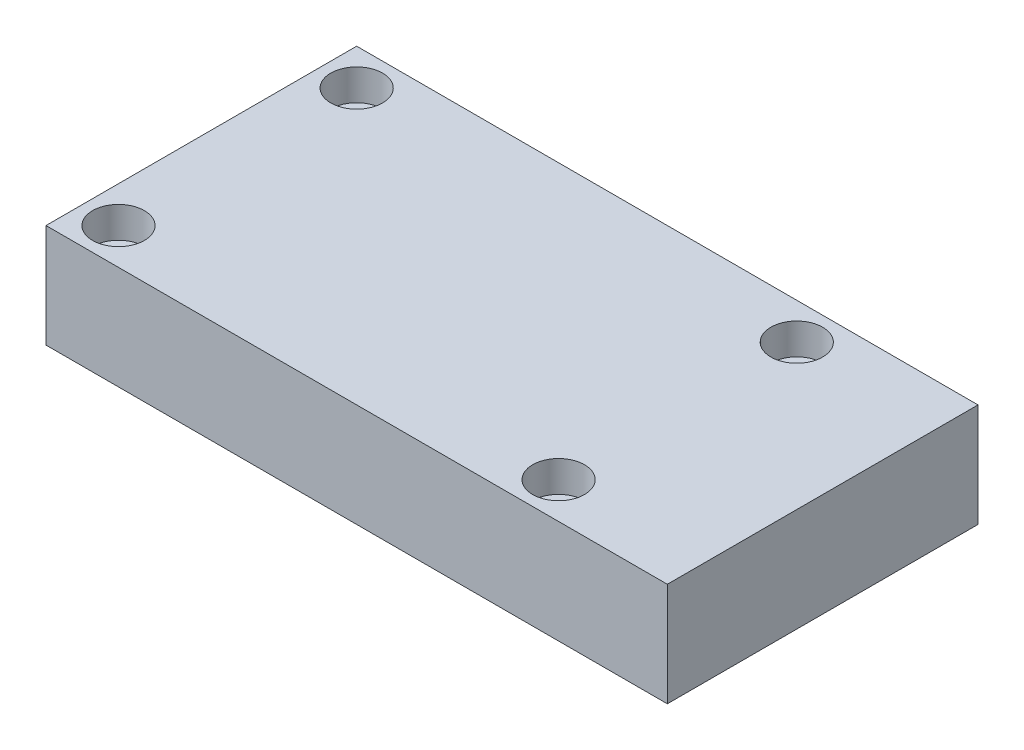
ISO-10303-21;
HEADER;
FILE_DESCRIPTION(('STEP AP214'),'2;1');
FILE_NAME('part.step','',(''),(''),'','','');
FILE_SCHEMA(('AUTOMOTIVE_DESIGN { 1 0 10303 214 1 1 1 1 }'));
ENDSEC;
DATA;
#1=APPLICATION_CONTEXT('core data for automotive mechanical design processes');
#2=APPLICATION_PROTOCOL_DEFINITION('international standard','automotive_design',2000,#1);
#3=PRODUCT_CONTEXT('',#1,'mechanical');
#4=PRODUCT('Part','Part','',(#3));
#5=PRODUCT_RELATED_PRODUCT_CATEGORY('part','',(#4));
#6=PRODUCT_DEFINITION_FORMATION('','',#4);
#7=PRODUCT_DEFINITION_CONTEXT('part definition',#1,'design');
#8=PRODUCT_DEFINITION('design','',#6,#7);
#9=PRODUCT_DEFINITION_SHAPE('','',#8);
#10=(LENGTH_UNIT() NAMED_UNIT(*) SI_UNIT(.MILLI.,.METRE.));
#11=(NAMED_UNIT(*) PLANE_ANGLE_UNIT() SI_UNIT($,.RADIAN.));
#12=(NAMED_UNIT(*) SI_UNIT($,.STERADIAN.) SOLID_ANGLE_UNIT());
#13=UNCERTAINTY_MEASURE_WITH_UNIT(LENGTH_MEASURE(1.E-05),#10,'distance_accuracy_value','');
#14=(GEOMETRIC_REPRESENTATION_CONTEXT(3) GLOBAL_UNCERTAINTY_ASSIGNED_CONTEXT((#13)) GLOBAL_UNIT_ASSIGNED_CONTEXT((#10,
#11,#12)) REPRESENTATION_CONTEXT('',''));
#15=CARTESIAN_POINT('',(0.,0.,0.));
#16=DIRECTION('',(0.,0.,1.));
#17=DIRECTION('',(1.,0.,0.));
#18=AXIS2_PLACEMENT_3D('',#15,#16,#17);
#19=CARTESIAN_POINT('',(-55.7302262684999,25.4,42.36681927311));
#20=DIRECTION('',(1.,0.,0.));
#21=DIRECTION('',(0.,0.,-1.));
#22=AXIS2_PLACEMENT_3D('',#19,#20,#21);
#23=PLANE('',#22);
#24=DIRECTION('',(0.,0.,1.));
#25=VECTOR('',#24,1.);
#26=CARTESIAN_POINT('',(-55.7302262684999,0.,42.36681927311));
#27=LINE('',#26,#25);
#28=CARTESIAN_POINT('',(-55.7302262684999,0.,-33.8331807268901));
#29=VERTEX_POINT('',#28);
#30=CARTESIAN_POINT('',(-55.7302262684999,0.,42.36681927311));
#31=VERTEX_POINT('',#30);
#32=EDGE_CURVE('E96',#29,#31,#27,.T.);
#33=ORIENTED_EDGE('',*,*,#32,.T.);
#34=DIRECTION('',(0.,-1.,0.));
#35=VECTOR('',#34,1.);
#36=CARTESIAN_POINT('',(-55.7302262684999,25.4,42.36681927311));
#37=LINE('',#36,#35);
#38=CARTESIAN_POINT('',(-55.7302262684999,25.4,42.36681927311));
#39=VERTEX_POINT('',#38);
#40=EDGE_CURVE('E11',#39,#31,#37,.T.);
#41=ORIENTED_EDGE('',*,*,#40,.F.);
#42=DIRECTION('',(0.,0.,1.));
#43=VECTOR('',#42,1.);
#44=CARTESIAN_POINT('',(-55.7302262684999,25.4,42.36681927311));
#45=LINE('',#44,#43);
#46=CARTESIAN_POINT('',(-55.7302262684999,25.4,-33.8331807268901));
#47=VERTEX_POINT('',#46);
#48=EDGE_CURVE('E84',#47,#39,#45,.T.);
#49=ORIENTED_EDGE('',*,*,#48,.F.);
#50=DIRECTION('',(0.,-1.,0.));
#51=VECTOR('',#50,1.);
#52=CARTESIAN_POINT('',(-55.7302262684999,25.4,-33.8331807268901));
#53=LINE('',#52,#51);
#54=EDGE_CURVE('E92',#47,#29,#53,.T.);
#55=ORIENTED_EDGE('',*,*,#54,.T.);
#56=EDGE_LOOP('',(#33,#41,#49,#55));
#57=FACE_BOUND('',#56,.T.);
#58=ADVANCED_FACE('F33',(#57),#23,.F.);
#59=CARTESIAN_POINT('',(-55.7302262684999,25.4,42.36681927311));
#60=DIRECTION('',(0.,0.,-1.));
#61=DIRECTION('',(-1.,0.,0.));
#62=AXIS2_PLACEMENT_3D('',#59,#60,#61);
#63=PLANE('',#62);
#64=DIRECTION('',(1.,0.,0.));
#65=VECTOR('',#64,1.);
#66=CARTESIAN_POINT('',(-55.7302262684999,0.,42.36681927311));
#67=LINE('',#66,#65);
#68=CARTESIAN_POINT('',(96.6697737315001,0.,42.36681927311));
#69=VERTEX_POINT('',#68);
#70=EDGE_CURVE('E88',#31,#69,#67,.T.);
#71=ORIENTED_EDGE('',*,*,#70,.T.);
#72=DIRECTION('',(0.,-1.,0.));
#73=VECTOR('',#72,1.);
#74=CARTESIAN_POINT('',(96.6697737315001,25.4,42.36681927311));
#75=LINE('',#74,#73);
#76=CARTESIAN_POINT('',(96.6697737315001,25.4,42.36681927311));
#77=VERTEX_POINT('',#76);
#78=EDGE_CURVE('E41',#77,#69,#75,.T.);
#79=ORIENTED_EDGE('',*,*,#78,.F.);
#80=DIRECTION('',(1.,0.,0.));
#81=VECTOR('',#80,1.);
#82=CARTESIAN_POINT('',(-55.7302262684999,25.4,42.36681927311));
#83=LINE('',#82,#81);
#84=EDGE_CURVE('E79',#39,#77,#83,.T.);
#85=ORIENTED_EDGE('',*,*,#84,.F.);
#86=ORIENTED_EDGE('',*,*,#40,.T.);
#87=EDGE_LOOP('',(#71,#79,#85,#86));
#88=FACE_BOUND('',#87,.T.);
#89=ADVANCED_FACE('F87',(#88),#63,.F.);
#90=CARTESIAN_POINT('',(96.6697737315001,25.4,42.36681927311));
#91=DIRECTION('',(-1.,0.,0.));
#92=DIRECTION('',(0.,0.,1.));
#93=AXIS2_PLACEMENT_3D('',#90,#91,#92);
#94=PLANE('',#93);
#95=DIRECTION('',(0.,0.,-1.));
#96=VECTOR('',#95,1.);
#97=CARTESIAN_POINT('',(96.6697737315001,0.,42.36681927311));
#98=LINE('',#97,#96);
#99=CARTESIAN_POINT('',(96.6697737315001,0.,-33.83318072689));
#100=VERTEX_POINT('',#99);
#101=EDGE_CURVE('E66',#69,#100,#98,.T.);
#102=ORIENTED_EDGE('',*,*,#101,.T.);
#103=DIRECTION('',(0.,-1.,0.));
#104=VECTOR('',#103,1.);
#105=CARTESIAN_POINT('',(96.6697737315001,25.4,-33.83318072689));
#106=LINE('',#105,#104);
#107=CARTESIAN_POINT('',(96.6697737315001,25.4,-33.83318072689));
#108=VERTEX_POINT('',#107);
#109=EDGE_CURVE('E89',#108,#100,#106,.T.);
#110=ORIENTED_EDGE('',*,*,#109,.F.);
#111=DIRECTION('',(0.,0.,-1.));
#112=VECTOR('',#111,1.);
#113=CARTESIAN_POINT('',(96.6697737315001,25.4,42.36681927311));
#114=LINE('',#113,#112);
#115=EDGE_CURVE('E82',#77,#108,#114,.T.);
#116=ORIENTED_EDGE('',*,*,#115,.F.);
#117=ORIENTED_EDGE('',*,*,#78,.T.);
#118=EDGE_LOOP('',(#102,#110,#116,#117));
#119=FACE_BOUND('',#118,.T.);
#120=ADVANCED_FACE('F90',(#119),#94,.F.);
#121=CARTESIAN_POINT('',(-55.7302262684999,25.4,-33.8331807268901));
#122=DIRECTION('',(0.,0.,1.));
#123=DIRECTION('',(1.,0.,0.));
#124=AXIS2_PLACEMENT_3D('',#121,#122,#123);
#125=PLANE('',#124);
#126=DIRECTION('',(-1.,0.,0.));
#127=VECTOR('',#126,1.);
#128=CARTESIAN_POINT('',(-55.7302262684999,0.,-33.8331807268901));
#129=LINE('',#128,#127);
#130=EDGE_CURVE('E72',#100,#29,#129,.T.);
#131=ORIENTED_EDGE('',*,*,#130,.T.);
#132=ORIENTED_EDGE('',*,*,#54,.F.);
#133=DIRECTION('',(-1.,0.,0.));
#134=VECTOR('',#133,1.);
#135=CARTESIAN_POINT('',(-55.7302262684999,25.4,-33.8331807268901));
#136=LINE('',#135,#134);
#137=EDGE_CURVE('E49',#108,#47,#136,.T.);
#138=ORIENTED_EDGE('',*,*,#137,.F.);
#139=ORIENTED_EDGE('',*,*,#109,.T.);
#140=EDGE_LOOP('',(#131,#132,#138,#139));
#141=FACE_BOUND('',#140,.T.);
#142=ADVANCED_FACE('F104',(#141),#125,.F.);
#143=CARTESIAN_POINT('',(0.,25.4,0.));
#144=DIRECTION('',(0.,-1.,0.));
#145=DIRECTION('',(0.,0.,-1.));
#146=AXIS2_PLACEMENT_3D('',#143,#144,#145);
#147=PLANE('',#146);
#148=CARTESIAN_POINT('',(61.1097737315,25.4,33.47681927311));
#149=DIRECTION('',(0.,1.,0.));
#150=DIRECTION('',(0.,0.,1.));
#151=AXIS2_PLACEMENT_3D('',#148,#149,#150);
#152=CIRCLE('',#151,6.35);
#153=CARTESIAN_POINT('',(61.1097737315,25.4,39.8268192731099));
#154=VERTEX_POINT('',#153);
#155=EDGE_CURVE('E128',#154,#154,#152,.T.);
#156=ORIENTED_EDGE('',*,*,#155,.F.);
#157=EDGE_LOOP('',(#156));
#158=FACE_BOUND('',#157,.T.);
#159=CARTESIAN_POINT('',(61.1097737315,25.4,-24.94318072689));
#160=DIRECTION('',(0.,1.,0.));
#161=DIRECTION('',(0.,0.,1.));
#162=AXIS2_PLACEMENT_3D('',#159,#160,#161);
#163=CIRCLE('',#162,6.35);
#164=CARTESIAN_POINT('',(61.1097737315,25.4,-18.59318072689));
#165=VERTEX_POINT('',#164);
#166=EDGE_CURVE('E122',#165,#165,#163,.T.);
#167=ORIENTED_EDGE('',*,*,#166,.F.);
#168=EDGE_LOOP('',(#167));
#169=FACE_BOUND('',#168,.T.);
#170=CARTESIAN_POINT('',(-46.8402262684999,25.4,33.47681927311));
#171=DIRECTION('',(0.,1.,0.));
#172=DIRECTION('',(0.,0.,1.));
#173=AXIS2_PLACEMENT_3D('',#170,#171,#172);
#174=CIRCLE('',#173,6.35);
#175=CARTESIAN_POINT('',(-46.8402262684999,25.4,39.82681927311));
#176=VERTEX_POINT('',#175);
#177=EDGE_CURVE('E116',#176,#176,#174,.T.);
#178=ORIENTED_EDGE('',*,*,#177,.F.);
#179=EDGE_LOOP('',(#178));
#180=FACE_BOUND('',#179,.T.);
#181=CARTESIAN_POINT('',(-46.8402262684999,25.4,-24.94318072689));
#182=DIRECTION('',(0.,1.,0.));
#183=DIRECTION('',(0.,0.,1.));
#184=AXIS2_PLACEMENT_3D('',#181,#182,#183);
#185=CIRCLE('',#184,6.35);
#186=CARTESIAN_POINT('',(-46.8402262684999,25.4,-18.59318072689));
#187=VERTEX_POINT('',#186);
#188=EDGE_CURVE('E110',#187,#187,#185,.T.);
#189=ORIENTED_EDGE('',*,*,#188,.F.);
#190=EDGE_LOOP('',(#189));
#191=FACE_BOUND('',#190,.T.);
#192=ORIENTED_EDGE('',*,*,#48,.T.);
#193=ORIENTED_EDGE('',*,*,#84,.T.);
#194=ORIENTED_EDGE('',*,*,#115,.T.);
#195=ORIENTED_EDGE('',*,*,#137,.T.);
#196=EDGE_LOOP('',(#192,#193,#194,#195));
#197=FACE_BOUND('',#196,.T.);
#198=ADVANCED_FACE('F80',(#158,#169,#180,#191,#197),#147,.F.);
#199=CARTESIAN_POINT('',(0.,0.,0.));
#200=DIRECTION('',(0.,-1.,0.));
#201=DIRECTION('',(0.,0.,-1.));
#202=AXIS2_PLACEMENT_3D('',#199,#200,#201);
#203=PLANE('',#202);
#204=ORIENTED_EDGE('',*,*,#32,.F.);
#205=ORIENTED_EDGE('',*,*,#130,.F.);
#206=ORIENTED_EDGE('',*,*,#101,.F.);
#207=ORIENTED_EDGE('',*,*,#70,.F.);
#208=EDGE_LOOP('',(#204,#205,#206,#207));
#209=FACE_BOUND('',#208,.T.);
#210=ADVANCED_FACE('F107',(#209),#203,.T.);
#211=CARTESIAN_POINT('',(-46.8402262684999,17.78,-24.94318072689));
#212=DIRECTION('',(0.,1.,0.));
#213=DIRECTION('',(0.,0.,1.));
#214=AXIS2_PLACEMENT_3D('',#211,#212,#213);
#215=CYLINDRICAL_SURFACE('',#214,6.35);
#216=CARTESIAN_POINT('',(-46.8402262684999,17.78,-24.94318072689));
#217=DIRECTION('',(0.,1.,0.));
#218=DIRECTION('',(0.,0.,1.));
#219=AXIS2_PLACEMENT_3D('',#216,#217,#218);
#220=CIRCLE('',#219,6.35);
#221=CARTESIAN_POINT('',(-46.8402262684999,17.78,-18.59318072689));
#222=VERTEX_POINT('',#221);
#223=EDGE_CURVE('E99',#222,#222,#220,.T.);
#224=CARTESIAN_POINT('',(-46.8402262684999,17.78,-18.59318072689));
#225=CARTESIAN_POINT('',(-46.8402262684999,17.859375,-18.59318072689));
#226=CARTESIAN_POINT('',(-46.8402262684999,17.93875,-18.59318072689));
#227=CARTESIAN_POINT('',(-46.8402262684999,18.0975,-18.59318072689));
#228=CARTESIAN_POINT('',(-46.8402262684999,18.176875,-18.59318072689));
#229=CARTESIAN_POINT('',(-46.8402262684999,18.335625,-18.59318072689));
#230=CARTESIAN_POINT('',(-46.8402262684999,18.415,-18.59318072689));
#231=CARTESIAN_POINT('',(-46.8402262684999,18.57375,-18.59318072689));
#232=CARTESIAN_POINT('',(-46.8402262684999,18.653125,-18.59318072689));
#233=CARTESIAN_POINT('',(-46.8402262684999,18.811875,-18.59318072689));
#234=CARTESIAN_POINT('',(-46.8402262684999,18.89125,-18.59318072689));
#235=CARTESIAN_POINT('',(-46.8402262684999,19.05,-18.59318072689));
#236=CARTESIAN_POINT('',(-46.8402262684999,19.129375,-18.59318072689));
#237=CARTESIAN_POINT('',(-46.8402262684999,19.288125,-18.59318072689));
#238=CARTESIAN_POINT('',(-46.8402262684999,19.3675,-18.59318072689));
#239=CARTESIAN_POINT('',(-46.8402262684999,19.52625,-18.59318072689));
#240=CARTESIAN_POINT('',(-46.8402262684999,19.605625,-18.59318072689));
#241=CARTESIAN_POINT('',(-46.8402262684999,19.764375,-18.59318072689));
#242=CARTESIAN_POINT('',(-46.8402262684999,19.84375,-18.59318072689));
#243=CARTESIAN_POINT('',(-46.8402262684999,20.0025,-18.59318072689));
#244=CARTESIAN_POINT('',(-46.8402262684999,20.081875,-18.59318072689));
#245=CARTESIAN_POINT('',(-46.8402262684999,20.240625,-18.59318072689));
#246=CARTESIAN_POINT('',(-46.8402262684999,20.32,-18.59318072689));
#247=CARTESIAN_POINT('',(-46.8402262684999,20.47875,-18.59318072689));
#248=CARTESIAN_POINT('',(-46.8402262684999,20.558125,-18.59318072689));
#249=CARTESIAN_POINT('',(-46.8402262684999,20.716875,-18.59318072689));
#250=CARTESIAN_POINT('',(-46.8402262684999,20.79625,-18.59318072689));
#251=CARTESIAN_POINT('',(-46.8402262684999,20.955,-18.59318072689));
#252=CARTESIAN_POINT('',(-46.8402262684999,21.034375,-18.59318072689));
#253=CARTESIAN_POINT('',(-46.8402262684999,21.193125,-18.59318072689));
#254=CARTESIAN_POINT('',(-46.8402262684999,21.2725,-18.59318072689));
#255=CARTESIAN_POINT('',(-46.8402262684999,21.43125,-18.59318072689));
#256=CARTESIAN_POINT('',(-46.8402262684999,21.510625,-18.59318072689));
#257=CARTESIAN_POINT('',(-46.8402262684999,21.669375,-18.59318072689));
#258=CARTESIAN_POINT('',(-46.8402262684999,21.74875,-18.59318072689));
#259=CARTESIAN_POINT('',(-46.8402262684999,21.9075,-18.59318072689));
#260=CARTESIAN_POINT('',(-46.8402262684999,21.986875,-18.59318072689));
#261=CARTESIAN_POINT('',(-46.8402262684999,22.145625,-18.59318072689));
#262=CARTESIAN_POINT('',(-46.8402262684999,22.225,-18.59318072689));
#263=CARTESIAN_POINT('',(-46.8402262684999,22.38375,-18.59318072689));
#264=CARTESIAN_POINT('',(-46.8402262684999,22.463125,-18.59318072689));
#265=CARTESIAN_POINT('',(-46.8402262684999,22.621875,-18.59318072689));
#266=CARTESIAN_POINT('',(-46.8402262684999,22.70125,-18.59318072689));
#267=CARTESIAN_POINT('',(-46.8402262684999,22.86,-18.59318072689));
#268=CARTESIAN_POINT('',(-46.8402262684999,22.939375,-18.59318072689));
#269=CARTESIAN_POINT('',(-46.8402262684999,23.098125,-18.59318072689));
#270=CARTESIAN_POINT('',(-46.8402262684999,23.1775,-18.59318072689));
#271=CARTESIAN_POINT('',(-46.8402262684999,23.33625,-18.59318072689));
#272=CARTESIAN_POINT('',(-46.8402262684999,23.415625,-18.59318072689));
#273=CARTESIAN_POINT('',(-46.8402262684999,23.574375,-18.59318072689));
#274=CARTESIAN_POINT('',(-46.8402262684999,23.65375,-18.59318072689));
#275=CARTESIAN_POINT('',(-46.8402262684999,23.8125,-18.59318072689));
#276=CARTESIAN_POINT('',(-46.8402262684999,23.891875,-18.59318072689));
#277=CARTESIAN_POINT('',(-46.8402262684999,24.050625,-18.59318072689));
#278=CARTESIAN_POINT('',(-46.8402262684999,24.13,-18.59318072689));
#279=CARTESIAN_POINT('',(-46.8402262684999,24.28875,-18.59318072689));
#280=CARTESIAN_POINT('',(-46.8402262684999,24.368125,-18.59318072689));
#281=CARTESIAN_POINT('',(-46.8402262684999,24.526875,-18.59318072689));
#282=CARTESIAN_POINT('',(-46.8402262684999,24.60625,-18.59318072689));
#283=CARTESIAN_POINT('',(-46.8402262684999,24.765,-18.59318072689));
#284=CARTESIAN_POINT('',(-46.8402262684999,24.844375,-18.59318072689));
#285=CARTESIAN_POINT('',(-46.8402262684999,25.003125,-18.59318072689));
#286=CARTESIAN_POINT('',(-46.8402262684999,25.0825,-18.59318072689));
#287=CARTESIAN_POINT('',(-46.8402262684999,25.24125,-18.59318072689));
#288=CARTESIAN_POINT('',(-46.8402262684999,25.320625,-18.59318072689));
#289=CARTESIAN_POINT('',(-46.8402262684999,25.4,-18.59318072689));
#290=B_SPLINE_CURVE_WITH_KNOTS('',3,(#224,#225,#226,#227,#228,#229,#230,#231,#232,#233,#234,
#235,#236,#237,#238,#239,#240,#241,#242,#243,#244,#245,#246,#247,#248,#249,#250,#251,#252,#253,
#254,#255,#256,#257,#258,#259,#260,#261,#262,#263,#264,#265,#266,#267,#268,#269,#270,#271,#272,
#273,#274,#275,#276,#277,#278,#279,#280,#281,#282,#283,#284,#285,#286,#287,#288,#289),
.UNSPECIFIED.,.F.,.F.,(4,2,2,2,2,2,2,2,2,2,2,2,2,2,2,2,2,2,2,2,2,2,2,2,2,2,2,2,2,2,2,2,4),(0.,
0.238125000000002,0.476250000000001,0.714375000000003,0.952500000000002,1.190625,1.42875,
1.666875,1.905,2.143125,2.38125,2.619375,2.8575,3.095625,3.33375,3.571875,3.81,4.048125,4.28625,
4.524375,4.7625,5.000625,5.23875,5.476875,5.715,5.953125,6.19125,6.429375,6.6675,6.905625,
7.14375,7.381875,7.62),.UNSPECIFIED.);
#291=EDGE_CURVE('BSEAM152',#222,#187,#290,.T.);
#292=ORIENTED_EDGE('',*,*,#223,.F.);
#293=ORIENTED_EDGE('',*,*,#188,.T.);
#294=ORIENTED_EDGE('',*,*,#291,.T.);
#295=ORIENTED_EDGE('',*,*,#291,.F.);
#296=EDGE_LOOP('',(#292,#294,#293,#295));
#297=FACE_BOUND('',#296,.T.);
#298=ADVANCED_FACE('F152',(#297),#215,.F.);
#299=CARTESIAN_POINT('',(-46.8402262684999,17.78,-24.94318072689));
#300=DIRECTION('',(0.,1.,0.));
#301=DIRECTION('',(0.,0.,1.));
#302=AXIS2_PLACEMENT_3D('',#299,#300,#301);
#303=PLANE('',#302);
#304=ORIENTED_EDGE('',*,*,#223,.T.);
#305=EDGE_LOOP('',(#304));
#306=FACE_BOUND('',#305,.T.);
#307=ADVANCED_FACE('F154',(#306),#303,.T.);
#308=CARTESIAN_POINT('',(-46.8402262684999,17.78,33.47681927311));
#309=DIRECTION('',(0.,1.,0.));
#310=DIRECTION('',(0.,0.,1.));
#311=AXIS2_PLACEMENT_3D('',#308,#309,#310);
#312=CYLINDRICAL_SURFACE('',#311,6.35);
#313=CARTESIAN_POINT('',(-46.8402262684999,17.78,33.47681927311));
#314=DIRECTION('',(0.,1.,0.));
#315=DIRECTION('',(0.,0.,1.));
#316=AXIS2_PLACEMENT_3D('',#313,#314,#315);
#317=CIRCLE('',#316,6.35);
#318=CARTESIAN_POINT('',(-46.8402262684999,17.78,39.82681927311));
#319=VERTEX_POINT('',#318);
#320=EDGE_CURVE('E113',#319,#319,#317,.T.);
#321=CARTESIAN_POINT('',(-46.8402262684999,17.78,39.82681927311));
#322=CARTESIAN_POINT('',(-46.8402262684999,17.859375,39.82681927311));
#323=CARTESIAN_POINT('',(-46.8402262684999,17.93875,39.82681927311));
#324=CARTESIAN_POINT('',(-46.8402262684999,18.0975,39.82681927311));
#325=CARTESIAN_POINT('',(-46.8402262684999,18.176875,39.82681927311));
#326=CARTESIAN_POINT('',(-46.8402262684999,18.335625,39.82681927311));
#327=CARTESIAN_POINT('',(-46.8402262684999,18.415,39.82681927311));
#328=CARTESIAN_POINT('',(-46.8402262684999,18.57375,39.82681927311));
#329=CARTESIAN_POINT('',(-46.8402262684999,18.653125,39.82681927311));
#330=CARTESIAN_POINT('',(-46.8402262684999,18.811875,39.82681927311));
#331=CARTESIAN_POINT('',(-46.8402262684999,18.89125,39.82681927311));
#332=CARTESIAN_POINT('',(-46.8402262684999,19.05,39.82681927311));
#333=CARTESIAN_POINT('',(-46.8402262684999,19.129375,39.82681927311));
#334=CARTESIAN_POINT('',(-46.8402262684999,19.288125,39.82681927311));
#335=CARTESIAN_POINT('',(-46.8402262684999,19.3675,39.82681927311));
#336=CARTESIAN_POINT('',(-46.8402262684999,19.52625,39.82681927311));
#337=CARTESIAN_POINT('',(-46.8402262684999,19.605625,39.82681927311));
#338=CARTESIAN_POINT('',(-46.8402262684999,19.764375,39.82681927311));
#339=CARTESIAN_POINT('',(-46.8402262684999,19.84375,39.82681927311));
#340=CARTESIAN_POINT('',(-46.8402262684999,20.0025,39.82681927311));
#341=CARTESIAN_POINT('',(-46.8402262684999,20.081875,39.82681927311));
#342=CARTESIAN_POINT('',(-46.8402262684999,20.240625,39.82681927311));
#343=CARTESIAN_POINT('',(-46.8402262684999,20.32,39.82681927311));
#344=CARTESIAN_POINT('',(-46.8402262684999,20.47875,39.82681927311));
#345=CARTESIAN_POINT('',(-46.8402262684999,20.558125,39.82681927311));
#346=CARTESIAN_POINT('',(-46.8402262684999,20.716875,39.82681927311));
#347=CARTESIAN_POINT('',(-46.8402262684999,20.79625,39.82681927311));
#348=CARTESIAN_POINT('',(-46.8402262684999,20.955,39.82681927311));
#349=CARTESIAN_POINT('',(-46.8402262684999,21.034375,39.82681927311));
#350=CARTESIAN_POINT('',(-46.8402262684999,21.193125,39.82681927311));
#351=CARTESIAN_POINT('',(-46.8402262684999,21.2725,39.82681927311));
#352=CARTESIAN_POINT('',(-46.8402262684999,21.43125,39.82681927311));
#353=CARTESIAN_POINT('',(-46.8402262684999,21.510625,39.82681927311));
#354=CARTESIAN_POINT('',(-46.8402262684999,21.669375,39.82681927311));
#355=CARTESIAN_POINT('',(-46.8402262684999,21.74875,39.82681927311));
#356=CARTESIAN_POINT('',(-46.8402262684999,21.9075,39.82681927311));
#357=CARTESIAN_POINT('',(-46.8402262684999,21.986875,39.82681927311));
#358=CARTESIAN_POINT('',(-46.8402262684999,22.145625,39.82681927311));
#359=CARTESIAN_POINT('',(-46.8402262684999,22.225,39.82681927311));
#360=CARTESIAN_POINT('',(-46.8402262684999,22.38375,39.82681927311));
#361=CARTESIAN_POINT('',(-46.8402262684999,22.463125,39.82681927311));
#362=CARTESIAN_POINT('',(-46.8402262684999,22.621875,39.82681927311));
#363=CARTESIAN_POINT('',(-46.8402262684999,22.70125,39.82681927311));
#364=CARTESIAN_POINT('',(-46.8402262684999,22.86,39.82681927311));
#365=CARTESIAN_POINT('',(-46.8402262684999,22.939375,39.82681927311));
#366=CARTESIAN_POINT('',(-46.8402262684999,23.098125,39.82681927311));
#367=CARTESIAN_POINT('',(-46.8402262684999,23.1775,39.82681927311));
#368=CARTESIAN_POINT('',(-46.8402262684999,23.33625,39.82681927311));
#369=CARTESIAN_POINT('',(-46.8402262684999,23.415625,39.82681927311));
#370=CARTESIAN_POINT('',(-46.8402262684999,23.574375,39.82681927311));
#371=CARTESIAN_POINT('',(-46.8402262684999,23.65375,39.82681927311));
#372=CARTESIAN_POINT('',(-46.8402262684999,23.8125,39.82681927311));
#373=CARTESIAN_POINT('',(-46.8402262684999,23.891875,39.82681927311));
#374=CARTESIAN_POINT('',(-46.8402262684999,24.050625,39.82681927311));
#375=CARTESIAN_POINT('',(-46.8402262684999,24.13,39.82681927311));
#376=CARTESIAN_POINT('',(-46.8402262684999,24.28875,39.82681927311));
#377=CARTESIAN_POINT('',(-46.8402262684999,24.368125,39.82681927311));
#378=CARTESIAN_POINT('',(-46.8402262684999,24.526875,39.82681927311));
#379=CARTESIAN_POINT('',(-46.8402262684999,24.60625,39.82681927311));
#380=CARTESIAN_POINT('',(-46.8402262684999,24.765,39.82681927311));
#381=CARTESIAN_POINT('',(-46.8402262684999,24.844375,39.82681927311));
#382=CARTESIAN_POINT('',(-46.8402262684999,25.003125,39.82681927311));
#383=CARTESIAN_POINT('',(-46.8402262684999,25.0825,39.82681927311));
#384=CARTESIAN_POINT('',(-46.8402262684999,25.24125,39.82681927311));
#385=CARTESIAN_POINT('',(-46.8402262684999,25.320625,39.82681927311));
#386=CARTESIAN_POINT('',(-46.8402262684999,25.4,39.82681927311));
#387=B_SPLINE_CURVE_WITH_KNOTS('',3,(#321,#322,#323,#324,#325,#326,#327,#328,#329,#330,#331,
#332,#333,#334,#335,#336,#337,#338,#339,#340,#341,#342,#343,#344,#345,#346,#347,#348,#349,#350,
#351,#352,#353,#354,#355,#356,#357,#358,#359,#360,#361,#362,#363,#364,#365,#366,#367,#368,#369,
#370,#371,#372,#373,#374,#375,#376,#377,#378,#379,#380,#381,#382,#383,#384,#385,#386),
.UNSPECIFIED.,.F.,.F.,(4,2,2,2,2,2,2,2,2,2,2,2,2,2,2,2,2,2,2,2,2,2,2,2,2,2,2,2,2,2,2,2,4),(0.,
0.238125000000002,0.476250000000001,0.714375000000003,0.952500000000002,1.190625,1.42875,
1.666875,1.905,2.143125,2.38125,2.619375,2.8575,3.095625,3.33375,3.571875,3.81,4.048125,4.28625,
4.524375,4.7625,5.000625,5.23875,5.476875,5.715,5.953125,6.19125,6.429375,6.6675,6.905625,
7.14375,7.381875,7.62),.UNSPECIFIED.);
#388=EDGE_CURVE('BSEAM161',#319,#176,#387,.T.);
#389=ORIENTED_EDGE('',*,*,#320,.F.);
#390=ORIENTED_EDGE('',*,*,#177,.T.);
#391=ORIENTED_EDGE('',*,*,#388,.T.);
#392=ORIENTED_EDGE('',*,*,#388,.F.);
#393=EDGE_LOOP('',(#389,#391,#390,#392));
#394=FACE_BOUND('',#393,.T.);
#395=ADVANCED_FACE('F161',(#394),#312,.F.);
#396=CARTESIAN_POINT('',(-46.8402262684999,17.78,33.47681927311));
#397=DIRECTION('',(0.,1.,0.));
#398=DIRECTION('',(0.,0.,1.));
#399=AXIS2_PLACEMENT_3D('',#396,#397,#398);
#400=PLANE('',#399);
#401=ORIENTED_EDGE('',*,*,#320,.T.);
#402=EDGE_LOOP('',(#401));
#403=FACE_BOUND('',#402,.T.);
#404=ADVANCED_FACE('F209',(#403),#400,.T.);
#405=CARTESIAN_POINT('',(61.1097737315,17.78,-24.94318072689));
#406=DIRECTION('',(0.,1.,0.));
#407=DIRECTION('',(0.,0.,1.));
#408=AXIS2_PLACEMENT_3D('',#405,#406,#407);
#409=CYLINDRICAL_SURFACE('',#408,6.35);
#410=CARTESIAN_POINT('',(61.1097737315,17.78,-24.94318072689));
#411=DIRECTION('',(0.,1.,0.));
#412=DIRECTION('',(0.,0.,1.));
#413=AXIS2_PLACEMENT_3D('',#410,#411,#412);
#414=CIRCLE('',#413,6.35);
#415=CARTESIAN_POINT('',(61.1097737315,17.78,-18.59318072689));
#416=VERTEX_POINT('',#415);
#417=EDGE_CURVE('E119',#416,#416,#414,.T.);
#418=CARTESIAN_POINT('',(61.1097737315,17.78,-18.59318072689));
#419=CARTESIAN_POINT('',(61.1097737315,17.859375,-18.59318072689));
#420=CARTESIAN_POINT('',(61.1097737315,17.93875,-18.59318072689));
#421=CARTESIAN_POINT('',(61.1097737315,18.0975,-18.59318072689));
#422=CARTESIAN_POINT('',(61.1097737315,18.176875,-18.59318072689));
#423=CARTESIAN_POINT('',(61.1097737315,18.335625,-18.59318072689));
#424=CARTESIAN_POINT('',(61.1097737315,18.415,-18.59318072689));
#425=CARTESIAN_POINT('',(61.1097737315,18.57375,-18.59318072689));
#426=CARTESIAN_POINT('',(61.1097737315,18.653125,-18.59318072689));
#427=CARTESIAN_POINT('',(61.1097737315,18.811875,-18.59318072689));
#428=CARTESIAN_POINT('',(61.1097737315,18.89125,-18.59318072689));
#429=CARTESIAN_POINT('',(61.1097737315,19.05,-18.59318072689));
#430=CARTESIAN_POINT('',(61.1097737315,19.129375,-18.59318072689));
#431=CARTESIAN_POINT('',(61.1097737315,19.288125,-18.59318072689));
#432=CARTESIAN_POINT('',(61.1097737315,19.3675,-18.59318072689));
#433=CARTESIAN_POINT('',(61.1097737315,19.52625,-18.59318072689));
#434=CARTESIAN_POINT('',(61.1097737315,19.605625,-18.59318072689));
#435=CARTESIAN_POINT('',(61.1097737315,19.764375,-18.59318072689));
#436=CARTESIAN_POINT('',(61.1097737315,19.84375,-18.59318072689));
#437=CARTESIAN_POINT('',(61.1097737315,20.0025,-18.59318072689));
#438=CARTESIAN_POINT('',(61.1097737315,20.081875,-18.59318072689));
#439=CARTESIAN_POINT('',(61.1097737315,20.240625,-18.59318072689));
#440=CARTESIAN_POINT('',(61.1097737315,20.32,-18.59318072689));
#441=CARTESIAN_POINT('',(61.1097737315,20.47875,-18.59318072689));
#442=CARTESIAN_POINT('',(61.1097737315,20.558125,-18.59318072689));
#443=CARTESIAN_POINT('',(61.1097737315,20.716875,-18.59318072689));
#444=CARTESIAN_POINT('',(61.1097737315,20.79625,-18.59318072689));
#445=CARTESIAN_POINT('',(61.1097737315,20.955,-18.59318072689));
#446=CARTESIAN_POINT('',(61.1097737315,21.034375,-18.59318072689));
#447=CARTESIAN_POINT('',(61.1097737315,21.193125,-18.59318072689));
#448=CARTESIAN_POINT('',(61.1097737315,21.2725,-18.59318072689));
#449=CARTESIAN_POINT('',(61.1097737315,21.43125,-18.59318072689));
#450=CARTESIAN_POINT('',(61.1097737315,21.510625,-18.59318072689));
#451=CARTESIAN_POINT('',(61.1097737315,21.669375,-18.59318072689));
#452=CARTESIAN_POINT('',(61.1097737315,21.74875,-18.59318072689));
#453=CARTESIAN_POINT('',(61.1097737315,21.9075,-18.59318072689));
#454=CARTESIAN_POINT('',(61.1097737315,21.986875,-18.59318072689));
#455=CARTESIAN_POINT('',(61.1097737315,22.145625,-18.59318072689));
#456=CARTESIAN_POINT('',(61.1097737315,22.225,-18.59318072689));
#457=CARTESIAN_POINT('',(61.1097737315,22.38375,-18.59318072689));
#458=CARTESIAN_POINT('',(61.1097737315,22.463125,-18.59318072689));
#459=CARTESIAN_POINT('',(61.1097737315,22.621875,-18.59318072689));
#460=CARTESIAN_POINT('',(61.1097737315,22.70125,-18.59318072689));
#461=CARTESIAN_POINT('',(61.1097737315,22.86,-18.59318072689));
#462=CARTESIAN_POINT('',(61.1097737315,22.939375,-18.59318072689));
#463=CARTESIAN_POINT('',(61.1097737315,23.098125,-18.59318072689));
#464=CARTESIAN_POINT('',(61.1097737315,23.1775,-18.59318072689));
#465=CARTESIAN_POINT('',(61.1097737315,23.33625,-18.59318072689));
#466=CARTESIAN_POINT('',(61.1097737315,23.415625,-18.59318072689));
#467=CARTESIAN_POINT('',(61.1097737315,23.574375,-18.59318072689));
#468=CARTESIAN_POINT('',(61.1097737315,23.65375,-18.59318072689));
#469=CARTESIAN_POINT('',(61.1097737315,23.8125,-18.59318072689));
#470=CARTESIAN_POINT('',(61.1097737315,23.891875,-18.59318072689));
#471=CARTESIAN_POINT('',(61.1097737315,24.050625,-18.59318072689));
#472=CARTESIAN_POINT('',(61.1097737315,24.13,-18.59318072689));
#473=CARTESIAN_POINT('',(61.1097737315,24.28875,-18.59318072689));
#474=CARTESIAN_POINT('',(61.1097737315,24.368125,-18.59318072689));
#475=CARTESIAN_POINT('',(61.1097737315,24.526875,-18.59318072689));
#476=CARTESIAN_POINT('',(61.1097737315,24.60625,-18.59318072689));
#477=CARTESIAN_POINT('',(61.1097737315,24.765,-18.59318072689));
#478=CARTESIAN_POINT('',(61.1097737315,24.844375,-18.59318072689));
#479=CARTESIAN_POINT('',(61.1097737315,25.003125,-18.59318072689));
#480=CARTESIAN_POINT('',(61.1097737315,25.0825,-18.59318072689));
#481=CARTESIAN_POINT('',(61.1097737315,25.24125,-18.59318072689));
#482=CARTESIAN_POINT('',(61.1097737315,25.320625,-18.59318072689));
#483=CARTESIAN_POINT('',(61.1097737315,25.4,-18.59318072689));
#484=B_SPLINE_CURVE_WITH_KNOTS('',3,(#418,#419,#420,#421,#422,#423,#424,#425,#426,#427,#428,
#429,#430,#431,#432,#433,#434,#435,#436,#437,#438,#439,#440,#441,#442,#443,#444,#445,#446,#447,
#448,#449,#450,#451,#452,#453,#454,#455,#456,#457,#458,#459,#460,#461,#462,#463,#464,#465,#466,
#467,#468,#469,#470,#471,#472,#473,#474,#475,#476,#477,#478,#479,#480,#481,#482,#483),
.UNSPECIFIED.,.F.,.F.,(4,2,2,2,2,2,2,2,2,2,2,2,2,2,2,2,2,2,2,2,2,2,2,2,2,2,2,2,2,2,2,2,4),(0.,
0.238125000000002,0.476250000000001,0.714375000000003,0.952500000000002,1.190625,1.42875,
1.666875,1.905,2.143125,2.38125,2.619375,2.8575,3.095625,3.33375,3.571875,3.81,4.048125,4.28625,
4.524375,4.7625,5.000625,5.23875,5.476875,5.715,5.953125,6.19125,6.429375,6.6675,6.905625,
7.14375,7.381875,7.62),.UNSPECIFIED.);
#485=EDGE_CURVE('BSEAM218',#416,#165,#484,.T.);
#486=ORIENTED_EDGE('',*,*,#417,.F.);
#487=ORIENTED_EDGE('',*,*,#166,.T.);
#488=ORIENTED_EDGE('',*,*,#485,.T.);
#489=ORIENTED_EDGE('',*,*,#485,.F.);
#490=EDGE_LOOP('',(#486,#488,#487,#489));
#491=FACE_BOUND('',#490,.T.);
#492=ADVANCED_FACE('F218',(#491),#409,.F.);
#493=CARTESIAN_POINT('',(61.1097737315,17.78,-24.94318072689));
#494=DIRECTION('',(0.,1.,0.));
#495=DIRECTION('',(0.,0.,1.));
#496=AXIS2_PLACEMENT_3D('',#493,#494,#495);
#497=PLANE('',#496);
#498=ORIENTED_EDGE('',*,*,#417,.T.);
#499=EDGE_LOOP('',(#498));
#500=FACE_BOUND('',#499,.T.);
#501=ADVANCED_FACE('F139',(#500),#497,.T.);
#502=CARTESIAN_POINT('',(61.1097737315,17.78,33.47681927311));
#503=DIRECTION('',(0.,1.,0.));
#504=DIRECTION('',(0.,0.,1.));
#505=AXIS2_PLACEMENT_3D('',#502,#503,#504);
#506=CYLINDRICAL_SURFACE('',#505,6.35);
#507=CARTESIAN_POINT('',(61.1097737315,17.78,33.47681927311));
#508=DIRECTION('',(0.,1.,0.));
#509=DIRECTION('',(0.,0.,1.));
#510=AXIS2_PLACEMENT_3D('',#507,#508,#509);
#511=CIRCLE('',#510,6.35);
#512=CARTESIAN_POINT('',(61.1097737315,17.78,39.8268192731099));
#513=VERTEX_POINT('',#512);
#514=EDGE_CURVE('E125',#513,#513,#511,.T.);
#515=CARTESIAN_POINT('',(61.1097737315,17.78,39.8268192731099));
#516=CARTESIAN_POINT('',(61.1097737315,17.859375,39.8268192731099));
#517=CARTESIAN_POINT('',(61.1097737315,17.93875,39.8268192731099));
#518=CARTESIAN_POINT('',(61.1097737315,18.0975,39.8268192731099));
#519=CARTESIAN_POINT('',(61.1097737315,18.176875,39.8268192731099));
#520=CARTESIAN_POINT('',(61.1097737315,18.335625,39.8268192731099));
#521=CARTESIAN_POINT('',(61.1097737315,18.415,39.8268192731099));
#522=CARTESIAN_POINT('',(61.1097737315,18.57375,39.8268192731099));
#523=CARTESIAN_POINT('',(61.1097737315,18.653125,39.8268192731099));
#524=CARTESIAN_POINT('',(61.1097737315,18.811875,39.8268192731099));
#525=CARTESIAN_POINT('',(61.1097737315,18.89125,39.8268192731099));
#526=CARTESIAN_POINT('',(61.1097737315,19.05,39.8268192731099));
#527=CARTESIAN_POINT('',(61.1097737315,19.129375,39.8268192731099));
#528=CARTESIAN_POINT('',(61.1097737315,19.288125,39.8268192731099));
#529=CARTESIAN_POINT('',(61.1097737315,19.3675,39.8268192731099));
#530=CARTESIAN_POINT('',(61.1097737315,19.52625,39.8268192731099));
#531=CARTESIAN_POINT('',(61.1097737315,19.605625,39.8268192731099));
#532=CARTESIAN_POINT('',(61.1097737315,19.764375,39.8268192731099));
#533=CARTESIAN_POINT('',(61.1097737315,19.84375,39.8268192731099));
#534=CARTESIAN_POINT('',(61.1097737315,20.0025,39.8268192731099));
#535=CARTESIAN_POINT('',(61.1097737315,20.081875,39.8268192731099));
#536=CARTESIAN_POINT('',(61.1097737315,20.240625,39.8268192731099));
#537=CARTESIAN_POINT('',(61.1097737315,20.32,39.8268192731099));
#538=CARTESIAN_POINT('',(61.1097737315,20.47875,39.8268192731099));
#539=CARTESIAN_POINT('',(61.1097737315,20.558125,39.8268192731099));
#540=CARTESIAN_POINT('',(61.1097737315,20.716875,39.8268192731099));
#541=CARTESIAN_POINT('',(61.1097737315,20.79625,39.8268192731099));
#542=CARTESIAN_POINT('',(61.1097737315,20.955,39.8268192731099));
#543=CARTESIAN_POINT('',(61.1097737315,21.034375,39.8268192731099));
#544=CARTESIAN_POINT('',(61.1097737315,21.193125,39.8268192731099));
#545=CARTESIAN_POINT('',(61.1097737315,21.2725,39.8268192731099));
#546=CARTESIAN_POINT('',(61.1097737315,21.43125,39.8268192731099));
#547=CARTESIAN_POINT('',(61.1097737315,21.510625,39.8268192731099));
#548=CARTESIAN_POINT('',(61.1097737315,21.669375,39.8268192731099));
#549=CARTESIAN_POINT('',(61.1097737315,21.74875,39.8268192731099));
#550=CARTESIAN_POINT('',(61.1097737315,21.9075,39.8268192731099));
#551=CARTESIAN_POINT('',(61.1097737315,21.986875,39.8268192731099));
#552=CARTESIAN_POINT('',(61.1097737315,22.145625,39.8268192731099));
#553=CARTESIAN_POINT('',(61.1097737315,22.225,39.8268192731099));
#554=CARTESIAN_POINT('',(61.1097737315,22.38375,39.8268192731099));
#555=CARTESIAN_POINT('',(61.1097737315,22.463125,39.8268192731099));
#556=CARTESIAN_POINT('',(61.1097737315,22.621875,39.8268192731099));
#557=CARTESIAN_POINT('',(61.1097737315,22.70125,39.8268192731099));
#558=CARTESIAN_POINT('',(61.1097737315,22.86,39.8268192731099));
#559=CARTESIAN_POINT('',(61.1097737315,22.939375,39.8268192731099));
#560=CARTESIAN_POINT('',(61.1097737315,23.098125,39.8268192731099));
#561=CARTESIAN_POINT('',(61.1097737315,23.1775,39.8268192731099));
#562=CARTESIAN_POINT('',(61.1097737315,23.33625,39.8268192731099));
#563=CARTESIAN_POINT('',(61.1097737315,23.415625,39.8268192731099));
#564=CARTESIAN_POINT('',(61.1097737315,23.574375,39.8268192731099));
#565=CARTESIAN_POINT('',(61.1097737315,23.65375,39.8268192731099));
#566=CARTESIAN_POINT('',(61.1097737315,23.8125,39.8268192731099));
#567=CARTESIAN_POINT('',(61.1097737315,23.891875,39.8268192731099));
#568=CARTESIAN_POINT('',(61.1097737315,24.050625,39.8268192731099));
#569=CARTESIAN_POINT('',(61.1097737315,24.13,39.8268192731099));
#570=CARTESIAN_POINT('',(61.1097737315,24.28875,39.8268192731099));
#571=CARTESIAN_POINT('',(61.1097737315,24.368125,39.8268192731099));
#572=CARTESIAN_POINT('',(61.1097737315,24.526875,39.8268192731099));
#573=CARTESIAN_POINT('',(61.1097737315,24.60625,39.8268192731099));
#574=CARTESIAN_POINT('',(61.1097737315,24.765,39.8268192731099));
#575=CARTESIAN_POINT('',(61.1097737315,24.844375,39.8268192731099));
#576=CARTESIAN_POINT('',(61.1097737315,25.003125,39.8268192731099));
#577=CARTESIAN_POINT('',(61.1097737315,25.0825,39.8268192731099));
#578=CARTESIAN_POINT('',(61.1097737315,25.24125,39.8268192731099));
#579=CARTESIAN_POINT('',(61.1097737315,25.320625,39.8268192731099));
#580=CARTESIAN_POINT('',(61.1097737315,25.4,39.8268192731099));
#581=B_SPLINE_CURVE_WITH_KNOTS('',3,(#515,#516,#517,#518,#519,#520,#521,#522,#523,#524,#525,
#526,#527,#528,#529,#530,#531,#532,#533,#534,#535,#536,#537,#538,#539,#540,#541,#542,#543,#544,
#545,#546,#547,#548,#549,#550,#551,#552,#553,#554,#555,#556,#557,#558,#559,#560,#561,#562,#563,
#564,#565,#566,#567,#568,#569,#570,#571,#572,#573,#574,#575,#576,#577,#578,#579,#580),
.UNSPECIFIED.,.F.,.F.,(4,2,2,2,2,2,2,2,2,2,2,2,2,2,2,2,2,2,2,2,2,2,2,2,2,2,2,2,2,2,2,2,4),(0.,
0.238125000000002,0.476250000000001,0.714375000000003,0.952500000000002,1.190625,1.42875,
1.666875,1.905,2.143125,2.38125,2.619375,2.8575,3.095625,3.33375,3.571875,3.81,4.048125,4.28625,
4.524375,4.7625,5.000625,5.23875,5.476875,5.715,5.953125,6.19125,6.429375,6.6675,6.905625,
7.14375,7.381875,7.62),.UNSPECIFIED.);
#582=EDGE_CURVE('BSEAM136',#513,#154,#581,.T.);
#583=ORIENTED_EDGE('',*,*,#514,.F.);
#584=ORIENTED_EDGE('',*,*,#155,.T.);
#585=ORIENTED_EDGE('',*,*,#582,.T.);
#586=ORIENTED_EDGE('',*,*,#582,.F.);
#587=EDGE_LOOP('',(#583,#585,#584,#586));
#588=FACE_BOUND('',#587,.T.);
#589=ADVANCED_FACE('F136',(#588),#506,.F.);
#590=CARTESIAN_POINT('',(61.1097737315,17.78,33.47681927311));
#591=DIRECTION('',(0.,1.,0.));
#592=DIRECTION('',(0.,0.,1.));
#593=AXIS2_PLACEMENT_3D('',#590,#591,#592);
#594=PLANE('',#593);
#595=ORIENTED_EDGE('',*,*,#514,.T.);
#596=EDGE_LOOP('',(#595));
#597=FACE_BOUND('',#596,.T.);
#598=ADVANCED_FACE('F134',(#597),#594,.T.);
#599=CLOSED_SHELL('',(#58,#89,#120,#142,#198,#210,#298,#307,#395,#404,#492,#501,#589,#598));
#600=MANIFOLD_SOLID_BREP('B2',#599);
#601=ADVANCED_BREP_SHAPE_REPRESENTATION('',(#18,#600),#14);
#602=SHAPE_DEFINITION_REPRESENTATION(#9,#601);
ENDSEC;
END-ISO-10303-21;
